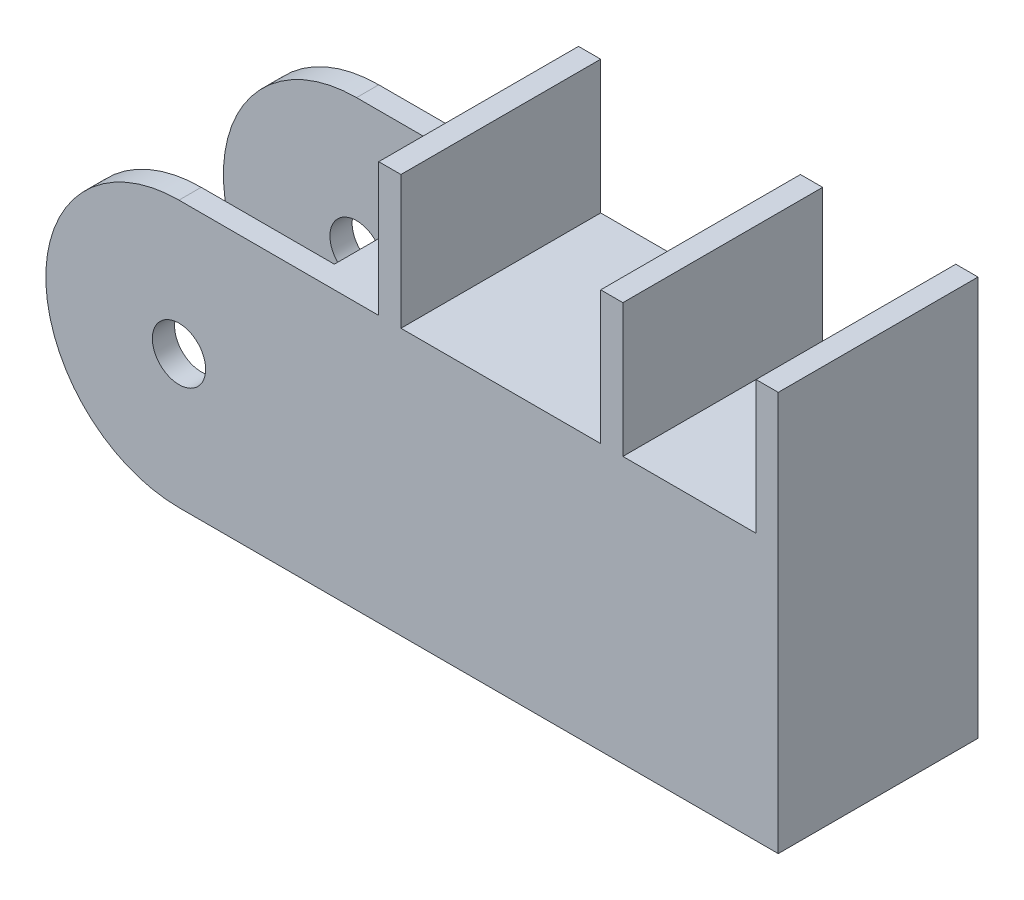
ISO-10303-21;
HEADER;
FILE_DESCRIPTION(('STEP AP214'),'2;1');
FILE_NAME('part.step','',(''),(''),'','','');
FILE_SCHEMA(('AUTOMOTIVE_DESIGN { 1 0 10303 214 1 1 1 1 }'));
ENDSEC;
DATA;
#1=APPLICATION_CONTEXT('core data for automotive mechanical design processes');
#2=APPLICATION_PROTOCOL_DEFINITION('international standard','automotive_design',2000,#1);
#3=PRODUCT_CONTEXT('',#1,'mechanical');
#4=PRODUCT('Part','Part','',(#3));
#5=PRODUCT_RELATED_PRODUCT_CATEGORY('part','',(#4));
#6=PRODUCT_DEFINITION_FORMATION('','',#4);
#7=PRODUCT_DEFINITION_CONTEXT('part definition',#1,'design');
#8=PRODUCT_DEFINITION('design','',#6,#7);
#9=PRODUCT_DEFINITION_SHAPE('','',#8);
#10=(LENGTH_UNIT() NAMED_UNIT(*) SI_UNIT(.MILLI.,.METRE.));
#11=(NAMED_UNIT(*) PLANE_ANGLE_UNIT() SI_UNIT($,.RADIAN.));
#12=(NAMED_UNIT(*) SI_UNIT($,.STERADIAN.) SOLID_ANGLE_UNIT());
#13=UNCERTAINTY_MEASURE_WITH_UNIT(LENGTH_MEASURE(1.E-05),#10,'distance_accuracy_value','');
#14=(GEOMETRIC_REPRESENTATION_CONTEXT(3) GLOBAL_UNCERTAINTY_ASSIGNED_CONTEXT((#13)) GLOBAL_UNIT_ASSIGNED_CONTEXT((#10,
#11,#12)) REPRESENTATION_CONTEXT('',''));
#15=CARTESIAN_POINT('',(0.,0.,0.));
#16=DIRECTION('',(0.,0.,1.));
#17=DIRECTION('',(1.,0.,0.));
#18=AXIS2_PLACEMENT_3D('',#15,#16,#17);
#19=CARTESIAN_POINT('',(-65.,30.,5.));
#20=DIRECTION('',(0.,-1.,0.));
#21=DIRECTION('',(0.,0.,-1.));
#22=AXIS2_PLACEMENT_3D('',#19,#20,#21);
#23=PLANE('',#22);
#24=DIRECTION('',(-1.,0.,0.));
#25=VECTOR('',#24,1.);
#26=CARTESIAN_POINT('',(-65.,30.,45.));
#27=LINE('',#26,#25);
#28=CARTESIAN_POINT('',(-20.,30.,45.));
#29=VERTEX_POINT('',#28);
#30=CARTESIAN_POINT('',(-65.,30.,45.));
#31=VERTEX_POINT('',#30);
#32=EDGE_CURVE('E340',#29,#31,#27,.T.);
#33=ORIENTED_EDGE('',*,*,#32,.F.);
#34=DIRECTION('',(0.,0.,1.));
#35=VECTOR('',#34,1.);
#36=CARTESIAN_POINT('',(-20.,30.,-90.1387818865997));
#37=LINE('',#36,#35);
#38=CARTESIAN_POINT('',(-20.,30.,0.));
#39=VERTEX_POINT('',#38);
#40=EDGE_CURVE('E201',#39,#29,#37,.T.);
#41=ORIENTED_EDGE('',*,*,#40,.F.);
#42=DIRECTION('',(-1.,0.,0.));
#43=VECTOR('',#42,1.);
#44=CARTESIAN_POINT('',(-65.,30.,0.));
#45=LINE('',#44,#43);
#46=CARTESIAN_POINT('',(-65.,30.,0.));
#47=VERTEX_POINT('',#46);
#48=EDGE_CURVE('E197',#39,#47,#45,.T.);
#49=ORIENTED_EDGE('',*,*,#48,.T.);
#50=DIRECTION('',(0.,0.,-1.));
#51=VECTOR('',#50,1.);
#52=CARTESIAN_POINT('',(-65.,30.,5.));
#53=LINE('',#52,#51);
#54=CARTESIAN_POINT('',(-65.,30.,5.));
#55=VERTEX_POINT('',#54);
#56=EDGE_CURVE('E47',#55,#47,#53,.T.);
#57=ORIENTED_EDGE('',*,*,#56,.F.);
#58=DIRECTION('',(-1.,0.,0.));
#59=VECTOR('',#58,1.);
#60=CARTESIAN_POINT('',(-65.,30.,5.));
#61=LINE('',#60,#59);
#62=CARTESIAN_POINT('',(-35.,30.,5.));
#63=VERTEX_POINT('',#62);
#64=EDGE_CURVE('E409',#63,#55,#61,.T.);
#65=ORIENTED_EDGE('',*,*,#64,.F.);
#66=DIRECTION('',(0.,0.,-1.));
#67=VECTOR('',#66,1.);
#68=CARTESIAN_POINT('',(-35.,30.,40.));
#69=LINE('',#68,#67);
#70=CARTESIAN_POINT('',(-35.,30.,40.));
#71=VERTEX_POINT('',#70);
#72=EDGE_CURVE('E379',#71,#63,#69,.T.);
#73=ORIENTED_EDGE('',*,*,#72,.F.);
#74=DIRECTION('',(-1.,0.,0.));
#75=VECTOR('',#74,1.);
#76=CARTESIAN_POINT('',(-65.,30.,40.));
#77=LINE('',#76,#75);
#78=CARTESIAN_POINT('',(-65.,30.,40.));
#79=VERTEX_POINT('',#78);
#80=EDGE_CURVE('E348',#71,#79,#77,.T.);
#81=ORIENTED_EDGE('',*,*,#80,.T.);
#82=DIRECTION('',(0.,0.,1.));
#83=VECTOR('',#82,1.);
#84=CARTESIAN_POINT('',(-65.,30.,40.));
#85=LINE('',#84,#83);
#86=EDGE_CURVE('E375',#79,#31,#85,.T.);
#87=ORIENTED_EDGE('',*,*,#86,.T.);
#88=EDGE_LOOP('',(#33,#41,#49,#57,#65,#73,#81,#87));
#89=FACE_BOUND('',#88,.T.);
#90=ADVANCED_FACE('F38',(#89),#23,.F.);
#91=CARTESIAN_POINT('',(30.,30.,0.));
#92=VERTEX_POINT('',#91);
#93=CARTESIAN_POINT('',(-15.,30.,0.));
#94=VERTEX_POINT('',#93);
#95=EDGE_CURVE('E424',#92,#94,#45,.T.);
#96=ORIENTED_EDGE('',*,*,#95,.T.);
#97=DIRECTION('',(0.,0.,1.));
#98=VECTOR('',#97,1.);
#99=CARTESIAN_POINT('',(-15.,30.,-90.1387818865997));
#100=LINE('',#99,#98);
#101=CARTESIAN_POINT('',(-15.,30.,45.));
#102=VERTEX_POINT('',#101);
#103=EDGE_CURVE('E225',#94,#102,#100,.T.);
#104=ORIENTED_EDGE('',*,*,#103,.T.);
#105=CARTESIAN_POINT('',(30.,30.,45.));
#106=VERTEX_POINT('',#105);
#107=EDGE_CURVE('E366',#106,#102,#27,.T.);
#108=ORIENTED_EDGE('',*,*,#107,.F.);
#109=DIRECTION('',(0.,0.,1.));
#110=VECTOR('',#109,1.);
#111=CARTESIAN_POINT('',(30.,30.,-90.1387818865997));
#112=LINE('',#111,#110);
#113=EDGE_CURVE('E289',#92,#106,#112,.T.);
#114=ORIENTED_EDGE('',*,*,#113,.F.);
#115=EDGE_LOOP('',(#96,#104,#108,#114));
#116=FACE_BOUND('',#115,.T.);
#117=ADVANCED_FACE('F484',(#116),#23,.F.);
#118=CARTESIAN_POINT('',(65.,30.,0.));
#119=VERTEX_POINT('',#118);
#120=CARTESIAN_POINT('',(35.,30.,0.));
#121=VERTEX_POINT('',#120);
#122=EDGE_CURVE('E419',#119,#121,#45,.T.);
#123=ORIENTED_EDGE('',*,*,#122,.T.);
#124=DIRECTION('',(0.,0.,1.));
#125=VECTOR('',#124,1.);
#126=CARTESIAN_POINT('',(35.,30.,-90.1387818865997));
#127=LINE('',#126,#125);
#128=CARTESIAN_POINT('',(35.,30.,45.));
#129=VERTEX_POINT('',#128);
#130=EDGE_CURVE('E285',#121,#129,#127,.T.);
#131=ORIENTED_EDGE('',*,*,#130,.T.);
#132=CARTESIAN_POINT('',(65.,30.,45.));
#133=VERTEX_POINT('',#132);
#134=EDGE_CURVE('E361',#133,#129,#27,.T.);
#135=ORIENTED_EDGE('',*,*,#134,.F.);
#136=DIRECTION('',(0.,0.,-1.));
#137=VECTOR('',#136,1.);
#138=CARTESIAN_POINT('',(65.,30.,5.));
#139=LINE('',#138,#137);
#140=EDGE_CURVE('E11',#133,#119,#139,.T.);
#141=ORIENTED_EDGE('',*,*,#140,.T.);
#142=EDGE_LOOP('',(#123,#131,#135,#141));
#143=FACE_BOUND('',#142,.T.);
#144=ADVANCED_FACE('F40',(#143),#23,.F.);
#145=CARTESIAN_POINT('',(-65.,0.,5.));
#146=DIRECTION('',(0.,0.,-1.));
#147=DIRECTION('',(-1.,0.,0.));
#148=AXIS2_PLACEMENT_3D('',#145,#146,#147);
#149=CYLINDRICAL_SURFACE('',#148,30.);
#150=CARTESIAN_POINT('',(-65.,0.,0.));
#151=DIRECTION('',(0.,0.,1.));
#152=DIRECTION('',(-1.,0.,0.));
#153=AXIS2_PLACEMENT_3D('',#150,#151,#152);
#154=CIRCLE('',#153,30.);
#155=CARTESIAN_POINT('',(-65.,-30.,0.));
#156=VERTEX_POINT('',#155);
#157=EDGE_CURVE('E423',#47,#156,#154,.T.);
#158=ORIENTED_EDGE('',*,*,#157,.T.);
#159=DIRECTION('',(0.,0.,-1.));
#160=VECTOR('',#159,1.);
#161=CARTESIAN_POINT('',(-65.,-30.,5.));
#162=LINE('',#161,#160);
#163=CARTESIAN_POINT('',(-65.,-30.,5.));
#164=VERTEX_POINT('',#163);
#165=EDGE_CURVE('E418',#164,#156,#162,.T.);
#166=ORIENTED_EDGE('',*,*,#165,.F.);
#167=CARTESIAN_POINT('',(-65.,0.,5.));
#168=DIRECTION('',(0.,0.,1.));
#169=DIRECTION('',(-1.,0.,0.));
#170=AXIS2_PLACEMENT_3D('',#167,#168,#169);
#171=CIRCLE('',#170,30.);
#172=EDGE_CURVE('E413',#55,#164,#171,.T.);
#173=ORIENTED_EDGE('',*,*,#172,.F.);
#174=ORIENTED_EDGE('',*,*,#56,.T.);
#175=EDGE_LOOP('',(#158,#166,#173,#174));
#176=FACE_BOUND('',#175,.T.);
#177=ADVANCED_FACE('F436',(#176),#149,.T.);
#178=CARTESIAN_POINT('',(-65.,-30.,5.));
#179=DIRECTION('',(0.,1.,0.));
#180=DIRECTION('',(0.,0.,1.));
#181=AXIS2_PLACEMENT_3D('',#178,#179,#180);
#182=PLANE('',#181);
#183=DIRECTION('',(1.,0.,0.));
#184=VECTOR('',#183,1.);
#185=CARTESIAN_POINT('',(-65.,-30.,0.));
#186=LINE('',#185,#184);
#187=CARTESIAN_POINT('',(70.,-30.,0.));
#188=VERTEX_POINT('',#187);
#189=EDGE_CURVE('E410',#156,#188,#186,.T.);
#190=ORIENTED_EDGE('',*,*,#189,.T.);
#191=DIRECTION('',(0.,0.,1.));
#192=VECTOR('',#191,1.);
#193=CARTESIAN_POINT('',(70.,-30.,-90.1387818865997));
#194=LINE('',#193,#192);
#195=CARTESIAN_POINT('',(70.,-30.,45.));
#196=VERTEX_POINT('',#195);
#197=EDGE_CURVE('E239',#188,#196,#194,.T.);
#198=ORIENTED_EDGE('',*,*,#197,.T.);
#199=DIRECTION('',(1.,0.,0.));
#200=VECTOR('',#199,1.);
#201=CARTESIAN_POINT('',(-65.,-30.,45.));
#202=LINE('',#201,#200);
#203=CARTESIAN_POINT('',(-65.,-30.,45.));
#204=VERTEX_POINT('',#203);
#205=EDGE_CURVE('E349',#204,#196,#202,.T.);
#206=ORIENTED_EDGE('',*,*,#205,.F.);
#207=DIRECTION('',(0.,0.,1.));
#208=VECTOR('',#207,1.);
#209=CARTESIAN_POINT('',(-65.,-30.,40.));
#210=LINE('',#209,#208);
#211=CARTESIAN_POINT('',(-65.,-30.,40.));
#212=VERTEX_POINT('',#211);
#213=EDGE_CURVE('E360',#212,#204,#210,.T.);
#214=ORIENTED_EDGE('',*,*,#213,.F.);
#215=DIRECTION('',(1.,0.,0.));
#216=VECTOR('',#215,1.);
#217=CARTESIAN_POINT('',(-65.,-30.,40.));
#218=LINE('',#217,#216);
#219=CARTESIAN_POINT('',(-35.,-30.,40.));
#220=VERTEX_POINT('',#219);
#221=EDGE_CURVE('E356',#212,#220,#218,.T.);
#222=ORIENTED_EDGE('',*,*,#221,.T.);
#223=DIRECTION('',(0.,0.,-1.));
#224=VECTOR('',#223,1.);
#225=CARTESIAN_POINT('',(-35.,-30.,40.));
#226=LINE('',#225,#224);
#227=CARTESIAN_POINT('',(-35.,-30.,5.));
#228=VERTEX_POINT('',#227);
#229=EDGE_CURVE('E315',#220,#228,#226,.T.);
#230=ORIENTED_EDGE('',*,*,#229,.T.);
#231=DIRECTION('',(1.,0.,0.));
#232=VECTOR('',#231,1.);
#233=CARTESIAN_POINT('',(-65.,-30.,5.));
#234=LINE('',#233,#232);
#235=EDGE_CURVE('E415',#164,#228,#234,.T.);
#236=ORIENTED_EDGE('',*,*,#235,.F.);
#237=ORIENTED_EDGE('',*,*,#165,.T.);
#238=EDGE_LOOP('',(#190,#198,#206,#214,#222,#230,#236,#237));
#239=FACE_BOUND('',#238,.T.);
#240=ADVANCED_FACE('F444',(#239),#182,.F.);
#241=CARTESIAN_POINT('',(-65.,0.,5.));
#242=DIRECTION('',(0.,0.,-1.));
#243=DIRECTION('',(-1.,0.,0.));
#244=AXIS2_PLACEMENT_3D('',#241,#242,#243);
#245=PLANE('',#244);
#246=CARTESIAN_POINT('',(-65.,0.,5.));
#247=DIRECTION('',(0.,0.,-1.));
#248=DIRECTION('',(-1.,0.,0.));
#249=AXIS2_PLACEMENT_3D('',#246,#247,#248);
#250=CIRCLE('',#249,6.);
#251=CARTESIAN_POINT('',(-59.,0.,5.));
#252=VERTEX_POINT('',#251);
#253=EDGE_CURVE('E311',#252,#252,#250,.T.);
#254=ORIENTED_EDGE('',*,*,#253,.T.);
#255=EDGE_LOOP('',(#254));
#256=FACE_BOUND('',#255,.T.);
#257=ORIENTED_EDGE('',*,*,#235,.T.);
#258=DIRECTION('',(0.,-1.,0.));
#259=VECTOR('',#258,1.);
#260=CARTESIAN_POINT('',(-35.,-25.,5.00000000000001));
#261=LINE('',#260,#259);
#262=CARTESIAN_POINT('',(-35.,-25.,5.));
#263=VERTEX_POINT('',#262);
#264=EDGE_CURVE('E336',#263,#228,#261,.T.);
#265=ORIENTED_EDGE('',*,*,#264,.F.);
#266=DIRECTION('',(-1.,0.,0.));
#267=VECTOR('',#266,1.);
#268=CARTESIAN_POINT('',(65.,-25.,5.));
#269=LINE('',#268,#267);
#270=CARTESIAN_POINT('',(65.,-25.,5.));
#271=VERTEX_POINT('',#270);
#272=EDGE_CURVE('E328',#271,#263,#269,.T.);
#273=ORIENTED_EDGE('',*,*,#272,.F.);
#274=DIRECTION('',(0.,1.,0.));
#275=VECTOR('',#274,1.);
#276=CARTESIAN_POINT('',(65.,-30.,5.));
#277=LINE('',#276,#275);
#278=CARTESIAN_POINT('',(65.,25.,5.));
#279=VERTEX_POINT('',#278);
#280=EDGE_CURVE('E405',#271,#279,#277,.T.);
#281=ORIENTED_EDGE('',*,*,#280,.T.);
#282=DIRECTION('',(-1.,0.,0.));
#283=VECTOR('',#282,1.);
#284=CARTESIAN_POINT('',(65.,25.,5.));
#285=LINE('',#284,#283);
#286=CARTESIAN_POINT('',(-35.,25.,5.00000000000001));
#287=VERTEX_POINT('',#286);
#288=EDGE_CURVE('E384',#279,#287,#285,.T.);
#289=ORIENTED_EDGE('',*,*,#288,.T.);
#290=DIRECTION('',(0.,1.,0.));
#291=VECTOR('',#290,1.);
#292=CARTESIAN_POINT('',(-35.,25.,5.00000000000001));
#293=LINE('',#292,#291);
#294=EDGE_CURVE('E395',#287,#63,#293,.T.);
#295=ORIENTED_EDGE('',*,*,#294,.T.);
#296=ORIENTED_EDGE('',*,*,#64,.T.);
#297=ORIENTED_EDGE('',*,*,#172,.T.);
#298=EDGE_LOOP('',(#257,#265,#273,#281,#289,#295,#296,#297));
#299=FACE_BOUND('',#298,.T.);
#300=ADVANCED_FACE('F448',(#256,#299),#245,.F.);
#301=CARTESIAN_POINT('',(-65.,0.,0.));
#302=DIRECTION('',(0.,0.,-1.));
#303=DIRECTION('',(-1.,0.,0.));
#304=AXIS2_PLACEMENT_3D('',#301,#302,#303);
#305=PLANE('',#304);
#306=CARTESIAN_POINT('',(-65.,0.,0.));
#307=DIRECTION('',(0.,0.,1.));
#308=DIRECTION('',(1.,0.,0.));
#309=AXIS2_PLACEMENT_3D('',#306,#307,#308);
#310=CIRCLE('',#309,6.);
#311=CARTESIAN_POINT('',(-59.,0.,0.));
#312=VERTEX_POINT('',#311);
#313=EDGE_CURVE('E300',#312,#312,#310,.T.);
#314=ORIENTED_EDGE('',*,*,#313,.T.);
#315=EDGE_LOOP('',(#314));
#316=FACE_BOUND('',#315,.T.);
#317=ORIENTED_EDGE('',*,*,#122,.F.);
#318=DIRECTION('',(0.,-1.,0.));
#319=VECTOR('',#318,1.);
#320=CARTESIAN_POINT('',(65.,-30.,0.));
#321=LINE('',#320,#319);
#322=CARTESIAN_POINT('',(65.,60.,0.));
#323=VERTEX_POINT('',#322);
#324=EDGE_CURVE('E247',#323,#119,#321,.T.);
#325=ORIENTED_EDGE('',*,*,#324,.F.);
#326=DIRECTION('',(-1.,0.,0.));
#327=VECTOR('',#326,1.);
#328=CARTESIAN_POINT('',(65.,60.,0.));
#329=LINE('',#328,#327);
#330=CARTESIAN_POINT('',(70.,60.,0.));
#331=VERTEX_POINT('',#330);
#332=EDGE_CURVE('E252',#331,#323,#329,.T.);
#333=ORIENTED_EDGE('',*,*,#332,.F.);
#334=DIRECTION('',(0.,1.,0.));
#335=VECTOR('',#334,1.);
#336=CARTESIAN_POINT('',(70.,-30.,0.));
#337=LINE('',#336,#335);
#338=EDGE_CURVE('E256',#188,#331,#337,.T.);
#339=ORIENTED_EDGE('',*,*,#338,.F.);
#340=ORIENTED_EDGE('',*,*,#189,.F.);
#341=ORIENTED_EDGE('',*,*,#157,.F.);
#342=ORIENTED_EDGE('',*,*,#48,.F.);
#343=DIRECTION('',(0.,-1.,0.));
#344=VECTOR('',#343,1.);
#345=CARTESIAN_POINT('',(-20.,30.,0.));
#346=LINE('',#345,#344);
#347=CARTESIAN_POINT('',(-20.,60.,0.));
#348=VERTEX_POINT('',#347);
#349=EDGE_CURVE('E189',#348,#39,#346,.T.);
#350=ORIENTED_EDGE('',*,*,#349,.F.);
#351=DIRECTION('',(-1.,0.,0.));
#352=VECTOR('',#351,1.);
#353=CARTESIAN_POINT('',(-15.,60.,0.));
#354=LINE('',#353,#352);
#355=CARTESIAN_POINT('',(-15.,60.,0.));
#356=VERTEX_POINT('',#355);
#357=EDGE_CURVE('E194',#356,#348,#354,.T.);
#358=ORIENTED_EDGE('',*,*,#357,.F.);
#359=DIRECTION('',(0.,1.,0.));
#360=VECTOR('',#359,1.);
#361=CARTESIAN_POINT('',(-15.,30.,0.));
#362=LINE('',#361,#360);
#363=EDGE_CURVE('E223',#94,#356,#362,.T.);
#364=ORIENTED_EDGE('',*,*,#363,.F.);
#365=ORIENTED_EDGE('',*,*,#95,.F.);
#366=DIRECTION('',(0.,-1.,0.));
#367=VECTOR('',#366,1.);
#368=CARTESIAN_POINT('',(30.,30.,0.));
#369=LINE('',#368,#367);
#370=CARTESIAN_POINT('',(30.,60.,0.));
#371=VERTEX_POINT('',#370);
#372=EDGE_CURVE('E286',#371,#92,#369,.T.);
#373=ORIENTED_EDGE('',*,*,#372,.F.);
#374=DIRECTION('',(-1.,0.,0.));
#375=VECTOR('',#374,1.);
#376=CARTESIAN_POINT('',(35.,60.,0.));
#377=LINE('',#376,#375);
#378=CARTESIAN_POINT('',(35.,60.,0.));
#379=VERTEX_POINT('',#378);
#380=EDGE_CURVE('E269',#379,#371,#377,.T.);
#381=ORIENTED_EDGE('',*,*,#380,.F.);
#382=DIRECTION('',(0.,1.,0.));
#383=VECTOR('',#382,1.);
#384=CARTESIAN_POINT('',(35.,30.,0.));
#385=LINE('',#384,#383);
#386=EDGE_CURVE('E280',#121,#379,#385,.T.);
#387=ORIENTED_EDGE('',*,*,#386,.F.);
#388=EDGE_LOOP('',(#317,#325,#333,#339,#340,#341,#342,#350,#358,#364,#365,#373,#381,#387));
#389=FACE_BOUND('',#388,.T.);
#390=ADVANCED_FACE('F192',(#316,#389),#305,.T.);
#391=CARTESIAN_POINT('',(-35.,25.,40.));
#392=DIRECTION('',(1.,0.,0.));
#393=DIRECTION('',(0.,0.,-1.));
#394=AXIS2_PLACEMENT_3D('',#391,#392,#393);
#395=PLANE('',#394);
#396=ORIENTED_EDGE('',*,*,#72,.T.);
#397=ORIENTED_EDGE('',*,*,#294,.F.);
#398=DIRECTION('',(0.,0.,-1.));
#399=VECTOR('',#398,1.);
#400=CARTESIAN_POINT('',(-35.,25.,40.));
#401=LINE('',#400,#399);
#402=CARTESIAN_POINT('',(-35.,25.,40.));
#403=VERTEX_POINT('',#402);
#404=EDGE_CURVE('E388',#403,#287,#401,.T.);
#405=ORIENTED_EDGE('',*,*,#404,.F.);
#406=DIRECTION('',(0.,1.,0.));
#407=VECTOR('',#406,1.);
#408=CARTESIAN_POINT('',(-35.,25.,40.));
#409=LINE('',#408,#407);
#410=EDGE_CURVE('E398',#403,#71,#409,.T.);
#411=ORIENTED_EDGE('',*,*,#410,.T.);
#412=EDGE_LOOP('',(#396,#397,#405,#411));
#413=FACE_BOUND('',#412,.T.);
#414=ADVANCED_FACE('F467',(#413),#395,.F.);
#415=CARTESIAN_POINT('',(0.,25.,0.));
#416=DIRECTION('',(0.,1.,0.));
#417=DIRECTION('',(0.,0.,1.));
#418=AXIS2_PLACEMENT_3D('',#415,#416,#417);
#419=PLANE('',#418);
#420=DIRECTION('',(0.,0.,-1.));
#421=VECTOR('',#420,1.);
#422=CARTESIAN_POINT('',(65.,25.,40.));
#423=LINE('',#422,#421);
#424=CARTESIAN_POINT('',(65.,25.,40.));
#425=VERTEX_POINT('',#424);
#426=EDGE_CURVE('E380',#425,#279,#423,.T.);
#427=ORIENTED_EDGE('',*,*,#426,.F.);
#428=DIRECTION('',(-1.,0.,0.));
#429=VECTOR('',#428,1.);
#430=CARTESIAN_POINT('',(65.,25.,40.));
#431=LINE('',#430,#429);
#432=EDGE_CURVE('E391',#425,#403,#431,.T.);
#433=ORIENTED_EDGE('',*,*,#432,.T.);
#434=ORIENTED_EDGE('',*,*,#404,.T.);
#435=ORIENTED_EDGE('',*,*,#288,.F.);
#436=EDGE_LOOP('',(#427,#433,#434,#435));
#437=FACE_BOUND('',#436,.T.);
#438=ADVANCED_FACE('F464',(#437),#419,.F.);
#439=CARTESIAN_POINT('',(-65.,0.,40.));
#440=DIRECTION('',(0.,0.,1.));
#441=DIRECTION('',(-1.,0.,0.));
#442=AXIS2_PLACEMENT_3D('',#439,#440,#441);
#443=CYLINDRICAL_SURFACE('',#442,30.);
#444=CARTESIAN_POINT('',(-65.,0.,45.));
#445=DIRECTION('',(0.,0.,1.));
#446=DIRECTION('',(-1.,0.,0.));
#447=AXIS2_PLACEMENT_3D('',#444,#445,#446);
#448=CIRCLE('',#447,30.);
#449=EDGE_CURVE('E365',#31,#204,#448,.T.);
#450=ORIENTED_EDGE('',*,*,#449,.F.);
#451=ORIENTED_EDGE('',*,*,#86,.F.);
#452=CARTESIAN_POINT('',(-65.,0.,40.));
#453=DIRECTION('',(0.,0.,1.));
#454=DIRECTION('',(-1.,0.,0.));
#455=AXIS2_PLACEMENT_3D('',#452,#453,#454);
#456=CIRCLE('',#455,30.);
#457=EDGE_CURVE('E352',#79,#212,#456,.T.);
#458=ORIENTED_EDGE('',*,*,#457,.T.);
#459=ORIENTED_EDGE('',*,*,#213,.T.);
#460=EDGE_LOOP('',(#450,#451,#458,#459));
#461=FACE_BOUND('',#460,.T.);
#462=ADVANCED_FACE('F475',(#461),#443,.T.);
#463=CARTESIAN_POINT('',(-65.,0.,40.));
#464=DIRECTION('',(0.,0.,1.));
#465=DIRECTION('',(-1.,0.,0.));
#466=AXIS2_PLACEMENT_3D('',#463,#464,#465);
#467=PLANE('',#466);
#468=CARTESIAN_POINT('',(-65.,0.,40.));
#469=DIRECTION('',(0.,0.,1.));
#470=DIRECTION('',(1.,0.,0.));
#471=AXIS2_PLACEMENT_3D('',#468,#469,#470);
#472=CIRCLE('',#471,6.);
#473=CARTESIAN_POINT('',(-59.,0.,40.));
#474=VERTEX_POINT('',#473);
#475=EDGE_CURVE('E304',#474,#474,#472,.T.);
#476=ORIENTED_EDGE('',*,*,#475,.T.);
#477=EDGE_LOOP('',(#476));
#478=FACE_BOUND('',#477,.T.);
#479=DIRECTION('',(-1.,0.,0.));
#480=VECTOR('',#479,1.);
#481=CARTESIAN_POINT('',(65.,-25.,40.));
#482=LINE('',#481,#480);
#483=CARTESIAN_POINT('',(65.,-25.,40.));
#484=VERTEX_POINT('',#483);
#485=CARTESIAN_POINT('',(-35.,-25.,40.));
#486=VERTEX_POINT('',#485);
#487=EDGE_CURVE('E320',#484,#486,#482,.T.);
#488=ORIENTED_EDGE('',*,*,#487,.T.);
#489=DIRECTION('',(0.,-1.,0.));
#490=VECTOR('',#489,1.);
#491=CARTESIAN_POINT('',(-35.,-25.,40.));
#492=LINE('',#491,#490);
#493=EDGE_CURVE('E332',#486,#220,#492,.T.);
#494=ORIENTED_EDGE('',*,*,#493,.T.);
#495=ORIENTED_EDGE('',*,*,#221,.F.);
#496=ORIENTED_EDGE('',*,*,#457,.F.);
#497=ORIENTED_EDGE('',*,*,#80,.F.);
#498=ORIENTED_EDGE('',*,*,#410,.F.);
#499=ORIENTED_EDGE('',*,*,#432,.F.);
#500=DIRECTION('',(0.,1.,0.));
#501=VECTOR('',#500,1.);
#502=CARTESIAN_POINT('',(65.,-30.,40.));
#503=LINE('',#502,#501);
#504=EDGE_CURVE('E344',#484,#425,#503,.T.);
#505=ORIENTED_EDGE('',*,*,#504,.F.);
#506=EDGE_LOOP('',(#488,#494,#495,#496,#497,#498,#499,#505));
#507=FACE_BOUND('',#506,.T.);
#508=ADVANCED_FACE('F456',(#478,#507),#467,.F.);
#509=CARTESIAN_POINT('',(-65.,0.,45.));
#510=DIRECTION('',(0.,0.,1.));
#511=DIRECTION('',(-1.,0.,0.));
#512=AXIS2_PLACEMENT_3D('',#509,#510,#511);
#513=PLANE('',#512);
#514=CARTESIAN_POINT('',(-65.,0.,45.));
#515=DIRECTION('',(0.,0.,1.));
#516=DIRECTION('',(1.,0.,0.));
#517=AXIS2_PLACEMENT_3D('',#514,#515,#516);
#518=CIRCLE('',#517,6.);
#519=CARTESIAN_POINT('',(-59.,0.,45.));
#520=VERTEX_POINT('',#519);
#521=EDGE_CURVE('E299',#520,#520,#518,.T.);
#522=ORIENTED_EDGE('',*,*,#521,.F.);
#523=EDGE_LOOP('',(#522));
#524=FACE_BOUND('',#523,.T.);
#525=ORIENTED_EDGE('',*,*,#205,.T.);
#526=DIRECTION('',(0.,1.,0.));
#527=VECTOR('',#526,1.);
#528=CARTESIAN_POINT('',(70.,-30.,45.));
#529=LINE('',#528,#527);
#530=CARTESIAN_POINT('',(70.,60.,45.));
#531=VERTEX_POINT('',#530);
#532=EDGE_CURVE('E240',#196,#531,#529,.T.);
#533=ORIENTED_EDGE('',*,*,#532,.T.);
#534=DIRECTION('',(-1.,0.,0.));
#535=VECTOR('',#534,1.);
#536=CARTESIAN_POINT('',(65.,60.,45.));
#537=LINE('',#536,#535);
#538=CARTESIAN_POINT('',(65.,60.,45.));
#539=VERTEX_POINT('',#538);
#540=EDGE_CURVE('E235',#531,#539,#537,.T.);
#541=ORIENTED_EDGE('',*,*,#540,.T.);
#542=DIRECTION('',(0.,-1.,0.));
#543=VECTOR('',#542,1.);
#544=CARTESIAN_POINT('',(65.,-30.,45.));
#545=LINE('',#544,#543);
#546=EDGE_CURVE('E234',#539,#133,#545,.T.);
#547=ORIENTED_EDGE('',*,*,#546,.T.);
#548=ORIENTED_EDGE('',*,*,#134,.T.);
#549=DIRECTION('',(0.,1.,0.));
#550=VECTOR('',#549,1.);
#551=CARTESIAN_POINT('',(35.,30.,45.));
#552=LINE('',#551,#550);
#553=CARTESIAN_POINT('',(35.,60.,45.));
#554=VERTEX_POINT('',#553);
#555=EDGE_CURVE('E250',#129,#554,#552,.T.);
#556=ORIENTED_EDGE('',*,*,#555,.T.);
#557=DIRECTION('',(-1.,0.,0.));
#558=VECTOR('',#557,1.);
#559=CARTESIAN_POINT('',(35.,60.,45.));
#560=LINE('',#559,#558);
#561=CARTESIAN_POINT('',(30.,60.,45.));
#562=VERTEX_POINT('',#561);
#563=EDGE_CURVE('E270',#554,#562,#560,.T.);
#564=ORIENTED_EDGE('',*,*,#563,.T.);
#565=DIRECTION('',(0.,-1.,0.));
#566=VECTOR('',#565,1.);
#567=CARTESIAN_POINT('',(30.,30.,45.));
#568=LINE('',#567,#566);
#569=EDGE_CURVE('E61',#562,#106,#568,.T.);
#570=ORIENTED_EDGE('',*,*,#569,.T.);
#571=ORIENTED_EDGE('',*,*,#107,.T.);
#572=DIRECTION('',(0.,1.,0.));
#573=VECTOR('',#572,1.);
#574=CARTESIAN_POINT('',(-15.,30.,45.));
#575=LINE('',#574,#573);
#576=CARTESIAN_POINT('',(-15.,60.,45.));
#577=VERTEX_POINT('',#576);
#578=EDGE_CURVE('E221',#102,#577,#575,.T.);
#579=ORIENTED_EDGE('',*,*,#578,.T.);
#580=DIRECTION('',(-1.,0.,0.));
#581=VECTOR('',#580,1.);
#582=CARTESIAN_POINT('',(-15.,60.,45.));
#583=LINE('',#582,#581);
#584=CARTESIAN_POINT('',(-20.,60.,45.));
#585=VERTEX_POINT('',#584);
#586=EDGE_CURVE('E217',#577,#585,#583,.T.);
#587=ORIENTED_EDGE('',*,*,#586,.T.);
#588=DIRECTION('',(0.,-1.,0.));
#589=VECTOR('',#588,1.);
#590=CARTESIAN_POINT('',(-20.,30.,45.));
#591=LINE('',#590,#589);
#592=EDGE_CURVE('E54',#585,#29,#591,.T.);
#593=ORIENTED_EDGE('',*,*,#592,.T.);
#594=ORIENTED_EDGE('',*,*,#32,.T.);
#595=ORIENTED_EDGE('',*,*,#449,.T.);
#596=EDGE_LOOP('',(#525,#533,#541,#547,#548,#556,#564,#570,#571,#579,#587,#593,#594,#595));
#597=FACE_BOUND('',#596,.T.);
#598=ADVANCED_FACE('F476',(#524,#597),#513,.T.);
#599=CARTESIAN_POINT('',(-35.,-25.,40.));
#600=DIRECTION('',(-1.,0.,0.));
#601=DIRECTION('',(0.,0.,1.));
#602=AXIS2_PLACEMENT_3D('',#599,#600,#601);
#603=PLANE('',#602);
#604=ORIENTED_EDGE('',*,*,#229,.F.);
#605=ORIENTED_EDGE('',*,*,#493,.F.);
#606=DIRECTION('',(0.,0.,-1.));
#607=VECTOR('',#606,1.);
#608=CARTESIAN_POINT('',(-35.,-25.,40.));
#609=LINE('',#608,#607);
#610=EDGE_CURVE('E324',#486,#263,#609,.T.);
#611=ORIENTED_EDGE('',*,*,#610,.T.);
#612=ORIENTED_EDGE('',*,*,#264,.T.);
#613=EDGE_LOOP('',(#604,#605,#611,#612));
#614=FACE_BOUND('',#613,.T.);
#615=ADVANCED_FACE('F450',(#614),#603,.T.);
#616=CARTESIAN_POINT('',(0.,-25.,0.));
#617=DIRECTION('',(0.,-1.,0.));
#618=DIRECTION('',(0.,0.,1.));
#619=AXIS2_PLACEMENT_3D('',#616,#617,#618);
#620=PLANE('',#619);
#621=DIRECTION('',(0.,0.,-1.));
#622=VECTOR('',#621,1.);
#623=CARTESIAN_POINT('',(65.,-25.,40.));
#624=LINE('',#623,#622);
#625=EDGE_CURVE('E316',#484,#271,#624,.T.);
#626=ORIENTED_EDGE('',*,*,#625,.T.);
#627=ORIENTED_EDGE('',*,*,#272,.T.);
#628=ORIENTED_EDGE('',*,*,#610,.F.);
#629=ORIENTED_EDGE('',*,*,#487,.F.);
#630=EDGE_LOOP('',(#626,#627,#628,#629));
#631=FACE_BOUND('',#630,.T.);
#632=ADVANCED_FACE('F453',(#631),#620,.F.);
#633=CARTESIAN_POINT('',(-65.,0.,0.));
#634=DIRECTION('',(0.,0.,1.));
#635=DIRECTION('',(1.,0.,0.));
#636=AXIS2_PLACEMENT_3D('',#633,#634,#635);
#637=CYLINDRICAL_SURFACE('',#636,6.);
#638=CARTESIAN_POINT('',(-59.,0.,45.));
#639=CARTESIAN_POINT('',(-59.,0.,44.9479166666667));
#640=CARTESIAN_POINT('',(-59.,0.,44.8958333333333));
#641=CARTESIAN_POINT('',(-59.,0.,44.7916666666667));
#642=CARTESIAN_POINT('',(-59.,0.,44.7395833333333));
#643=CARTESIAN_POINT('',(-59.,0.,44.6354166666667));
#644=CARTESIAN_POINT('',(-59.,0.,44.5833333333333));
#645=CARTESIAN_POINT('',(-59.,0.,44.4791666666667));
#646=CARTESIAN_POINT('',(-59.,0.,44.4270833333333));
#647=CARTESIAN_POINT('',(-59.,0.,44.3229166666667));
#648=CARTESIAN_POINT('',(-59.,0.,44.2708333333333));
#649=CARTESIAN_POINT('',(-59.,0.,44.1666666666667));
#650=CARTESIAN_POINT('',(-59.,0.,44.1145833333333));
#651=CARTESIAN_POINT('',(-59.,0.,44.0104166666667));
#652=CARTESIAN_POINT('',(-59.,0.,43.9583333333333));
#653=CARTESIAN_POINT('',(-59.,0.,43.8541666666667));
#654=CARTESIAN_POINT('',(-59.,0.,43.8020833333333));
#655=CARTESIAN_POINT('',(-59.,0.,43.6979166666667));
#656=CARTESIAN_POINT('',(-59.,0.,43.6458333333333));
#657=CARTESIAN_POINT('',(-59.,0.,43.5416666666667));
#658=CARTESIAN_POINT('',(-59.,0.,43.4895833333333));
#659=CARTESIAN_POINT('',(-59.,0.,43.3854166666667));
#660=CARTESIAN_POINT('',(-59.,0.,43.3333333333333));
#661=CARTESIAN_POINT('',(-59.,0.,43.2291666666667));
#662=CARTESIAN_POINT('',(-59.,0.,43.1770833333333));
#663=CARTESIAN_POINT('',(-59.,0.,43.0729166666667));
#664=CARTESIAN_POINT('',(-59.,0.,43.0208333333333));
#665=CARTESIAN_POINT('',(-59.,0.,42.9166666666667));
#666=CARTESIAN_POINT('',(-59.,0.,42.8645833333333));
#667=CARTESIAN_POINT('',(-59.,0.,42.7604166666667));
#668=CARTESIAN_POINT('',(-59.,0.,42.7083333333333));
#669=CARTESIAN_POINT('',(-59.,0.,42.6041666666667));
#670=CARTESIAN_POINT('',(-59.,0.,42.5520833333333));
#671=CARTESIAN_POINT('',(-59.,0.,42.4479166666667));
#672=CARTESIAN_POINT('',(-59.,0.,42.3958333333333));
#673=CARTESIAN_POINT('',(-59.,0.,42.2916666666667));
#674=CARTESIAN_POINT('',(-59.,0.,42.2395833333333));
#675=CARTESIAN_POINT('',(-59.,0.,42.1354166666667));
#676=CARTESIAN_POINT('',(-59.,0.,42.0833333333333));
#677=CARTESIAN_POINT('',(-59.,0.,41.9791666666667));
#678=CARTESIAN_POINT('',(-59.,0.,41.9270833333333));
#679=CARTESIAN_POINT('',(-59.,0.,41.8229166666667));
#680=CARTESIAN_POINT('',(-59.,0.,41.7708333333333));
#681=CARTESIAN_POINT('',(-59.,0.,41.6666666666667));
#682=CARTESIAN_POINT('',(-59.,0.,41.6145833333333));
#683=CARTESIAN_POINT('',(-59.,0.,41.5104166666667));
#684=CARTESIAN_POINT('',(-59.,0.,41.4583333333333));
#685=CARTESIAN_POINT('',(-59.,0.,41.3541666666667));
#686=CARTESIAN_POINT('',(-59.,0.,41.3020833333333));
#687=CARTESIAN_POINT('',(-59.,0.,41.1979166666667));
#688=CARTESIAN_POINT('',(-59.,0.,41.1458333333333));
#689=CARTESIAN_POINT('',(-59.,0.,41.0416666666667));
#690=CARTESIAN_POINT('',(-59.,0.,40.9895833333333));
#691=CARTESIAN_POINT('',(-59.,0.,40.8854166666667));
#692=CARTESIAN_POINT('',(-59.,0.,40.8333333333333));
#693=CARTESIAN_POINT('',(-59.,0.,40.7291666666667));
#694=CARTESIAN_POINT('',(-59.,0.,40.6770833333333));
#695=CARTESIAN_POINT('',(-59.,0.,40.5729166666667));
#696=CARTESIAN_POINT('',(-59.,0.,40.5208333333333));
#697=CARTESIAN_POINT('',(-59.,0.,40.4166666666667));
#698=CARTESIAN_POINT('',(-59.,0.,40.3645833333333));
#699=CARTESIAN_POINT('',(-59.,0.,40.2604166666667));
#700=CARTESIAN_POINT('',(-59.,0.,40.2083333333333));
#701=CARTESIAN_POINT('',(-59.,0.,40.1041666666667));
#702=CARTESIAN_POINT('',(-59.,0.,40.0520833333333));
#703=CARTESIAN_POINT('',(-59.,0.,40.));
#704=B_SPLINE_CURVE_WITH_KNOTS('',3,(#638,#639,#640,#641,#642,#643,#644,#645,#646,#647,#648,
#649,#650,#651,#652,#653,#654,#655,#656,#657,#658,#659,#660,#661,#662,#663,#664,#665,#666,#667,
#668,#669,#670,#671,#672,#673,#674,#675,#676,#677,#678,#679,#680,#681,#682,#683,#684,#685,#686,
#687,#688,#689,#690,#691,#692,#693,#694,#695,#696,#697,#698,#699,#700,#701,#702,#703),
.UNSPECIFIED.,.F.,.F.,(4,2,2,2,2,2,2,2,2,2,2,2,2,2,2,2,2,2,2,2,2,2,2,2,2,2,2,2,2,2,2,2,4),(0.,
0.156249999999997,0.3125,0.468750000000004,0.625000000000001,0.781249999999997,
0.937500000000001,1.09375,1.25,1.40625,1.5625,1.71875,1.875,2.03125,2.1875,2.34375000000001,2.5,
2.65625,2.8125,2.96875000000001,3.125,3.28125,3.4375,3.59375000000001,3.75,3.90625,4.0625,
4.21875000000001,4.375,4.53125,4.6875,4.84375000000001,5.),.UNSPECIFIED.);
#705=EDGE_CURVE('BSEAM559',#520,#474,#704,.T.);
#706=ORIENTED_EDGE('',*,*,#521,.T.);
#707=ORIENTED_EDGE('',*,*,#475,.F.);
#708=ORIENTED_EDGE('',*,*,#705,.T.);
#709=ORIENTED_EDGE('',*,*,#705,.F.);
#710=EDGE_LOOP('',(#706,#708,#707,#709));
#711=FACE_BOUND('',#710,.T.);
#712=ADVANCED_FACE('F559',(#711),#637,.F.);
#713=CARTESIAN_POINT('',(-59.,0.,0.));
#714=CARTESIAN_POINT('',(-59.,0.,0.0520833333333334));
#715=CARTESIAN_POINT('',(-59.,0.,0.104166666666667));
#716=CARTESIAN_POINT('',(-59.,0.,0.208333333333333));
#717=CARTESIAN_POINT('',(-59.,0.,0.260416666666667));
#718=CARTESIAN_POINT('',(-59.,0.,0.364583333333333));
#719=CARTESIAN_POINT('',(-59.,0.,0.416666666666667));
#720=CARTESIAN_POINT('',(-59.,0.,0.520833333333333));
#721=CARTESIAN_POINT('',(-59.,0.,0.572916666666667));
#722=CARTESIAN_POINT('',(-59.,0.,0.677083333333333));
#723=CARTESIAN_POINT('',(-59.,0.,0.729166666666667));
#724=CARTESIAN_POINT('',(-59.,0.,0.833333333333333));
#725=CARTESIAN_POINT('',(-59.,0.,0.885416666666667));
#726=CARTESIAN_POINT('',(-59.,0.,0.989583333333333));
#727=CARTESIAN_POINT('',(-59.,0.,1.04166666666667));
#728=CARTESIAN_POINT('',(-59.,0.,1.14583333333333));
#729=CARTESIAN_POINT('',(-59.,0.,1.19791666666667));
#730=CARTESIAN_POINT('',(-59.,0.,1.30208333333333));
#731=CARTESIAN_POINT('',(-59.,0.,1.35416666666667));
#732=CARTESIAN_POINT('',(-59.,0.,1.45833333333333));
#733=CARTESIAN_POINT('',(-59.,0.,1.51041666666667));
#734=CARTESIAN_POINT('',(-59.,0.,1.61458333333333));
#735=CARTESIAN_POINT('',(-59.,0.,1.66666666666667));
#736=CARTESIAN_POINT('',(-59.,0.,1.77083333333333));
#737=CARTESIAN_POINT('',(-59.,0.,1.82291666666667));
#738=CARTESIAN_POINT('',(-59.,0.,1.92708333333333));
#739=CARTESIAN_POINT('',(-59.,0.,1.97916666666667));
#740=CARTESIAN_POINT('',(-59.,0.,2.08333333333333));
#741=CARTESIAN_POINT('',(-59.,0.,2.13541666666667));
#742=CARTESIAN_POINT('',(-59.,0.,2.23958333333333));
#743=CARTESIAN_POINT('',(-59.,0.,2.29166666666667));
#744=CARTESIAN_POINT('',(-59.,0.,2.39583333333333));
#745=CARTESIAN_POINT('',(-59.,0.,2.44791666666667));
#746=CARTESIAN_POINT('',(-59.,0.,2.55208333333333));
#747=CARTESIAN_POINT('',(-59.,0.,2.60416666666667));
#748=CARTESIAN_POINT('',(-59.,0.,2.70833333333333));
#749=CARTESIAN_POINT('',(-59.,0.,2.76041666666667));
#750=CARTESIAN_POINT('',(-59.,0.,2.86458333333333));
#751=CARTESIAN_POINT('',(-59.,0.,2.91666666666667));
#752=CARTESIAN_POINT('',(-59.,0.,3.02083333333333));
#753=CARTESIAN_POINT('',(-59.,0.,3.07291666666667));
#754=CARTESIAN_POINT('',(-59.,0.,3.17708333333333));
#755=CARTESIAN_POINT('',(-59.,0.,3.22916666666667));
#756=CARTESIAN_POINT('',(-59.,0.,3.33333333333333));
#757=CARTESIAN_POINT('',(-59.,0.,3.38541666666667));
#758=CARTESIAN_POINT('',(-59.,0.,3.48958333333333));
#759=CARTESIAN_POINT('',(-59.,0.,3.54166666666667));
#760=CARTESIAN_POINT('',(-59.,0.,3.64583333333333));
#761=CARTESIAN_POINT('',(-59.,0.,3.69791666666667));
#762=CARTESIAN_POINT('',(-59.,0.,3.80208333333333));
#763=CARTESIAN_POINT('',(-59.,0.,3.85416666666667));
#764=CARTESIAN_POINT('',(-59.,0.,3.95833333333333));
#765=CARTESIAN_POINT('',(-59.,0.,4.01041666666667));
#766=CARTESIAN_POINT('',(-59.,0.,4.11458333333333));
#767=CARTESIAN_POINT('',(-59.,0.,4.16666666666667));
#768=CARTESIAN_POINT('',(-59.,0.,4.27083333333333));
#769=CARTESIAN_POINT('',(-59.,0.,4.32291666666667));
#770=CARTESIAN_POINT('',(-59.,0.,4.42708333333333));
#771=CARTESIAN_POINT('',(-59.,0.,4.47916666666667));
#772=CARTESIAN_POINT('',(-59.,0.,4.58333333333333));
#773=CARTESIAN_POINT('',(-59.,0.,4.63541666666667));
#774=CARTESIAN_POINT('',(-59.,0.,4.73958333333333));
#775=CARTESIAN_POINT('',(-59.,0.,4.79166666666667));
#776=CARTESIAN_POINT('',(-59.,0.,4.89583333333333));
#777=CARTESIAN_POINT('',(-59.,0.,4.94791666666667));
#778=CARTESIAN_POINT('',(-59.,0.,5.));
#779=B_SPLINE_CURVE_WITH_KNOTS('',3,(#713,#714,#715,#716,#717,#718,#719,#720,#721,#722,#723,
#724,#725,#726,#727,#728,#729,#730,#731,#732,#733,#734,#735,#736,#737,#738,#739,#740,#741,#742,
#743,#744,#745,#746,#747,#748,#749,#750,#751,#752,#753,#754,#755,#756,#757,#758,#759,#760,#761,
#762,#763,#764,#765,#766,#767,#768,#769,#770,#771,#772,#773,#774,#775,#776,#777,#778),
.UNSPECIFIED.,.F.,.F.,(4,2,2,2,2,2,2,2,2,2,2,2,2,2,2,2,2,2,2,2,2,2,2,2,2,2,2,2,2,2,2,2,4),(0.,
0.15625,0.3125,0.46875,0.625,0.78125,0.9375,1.09375,1.25,1.40625,1.5625,1.71875,1.875,2.03125,
2.1875,2.34375,2.5,2.65625,2.8125,2.96875,3.125,3.28125,3.4375,3.59375,3.75,3.90625,4.0625,
4.21875,4.375,4.53125,4.6875,4.84375,5.),.UNSPECIFIED.);
#780=EDGE_CURVE('BSEAM560',#312,#252,#779,.T.);
#781=ORIENTED_EDGE('',*,*,#313,.F.);
#782=ORIENTED_EDGE('',*,*,#253,.F.);
#783=ORIENTED_EDGE('',*,*,#780,.T.);
#784=ORIENTED_EDGE('',*,*,#780,.F.);
#785=EDGE_LOOP('',(#781,#783,#782,#784));
#786=FACE_BOUND('',#785,.T.);
#787=ADVANCED_FACE('F560',(#786),#637,.F.);
#788=CARTESIAN_POINT('',(35.,60.,-90.1387818865997));
#789=DIRECTION('',(0.,1.,0.));
#790=DIRECTION('',(0.,0.,1.));
#791=AXIS2_PLACEMENT_3D('',#788,#789,#790);
#792=PLANE('',#791);
#793=DIRECTION('',(0.,0.,1.));
#794=VECTOR('',#793,1.);
#795=CARTESIAN_POINT('',(35.,60.,-90.1387818865997));
#796=LINE('',#795,#794);
#797=EDGE_CURVE('E284',#379,#554,#796,.T.);
#798=ORIENTED_EDGE('',*,*,#797,.F.);
#799=ORIENTED_EDGE('',*,*,#380,.T.);
#800=DIRECTION('',(0.,0.,1.));
#801=VECTOR('',#800,1.);
#802=CARTESIAN_POINT('',(30.,60.,-90.1387818865997));
#803=LINE('',#802,#801);
#804=EDGE_CURVE('E279',#371,#562,#803,.T.);
#805=ORIENTED_EDGE('',*,*,#804,.T.);
#806=ORIENTED_EDGE('',*,*,#563,.F.);
#807=EDGE_LOOP('',(#798,#799,#805,#806));
#808=FACE_BOUND('',#807,.T.);
#809=ADVANCED_FACE('F499',(#808),#792,.T.);
#810=CARTESIAN_POINT('',(30.,30.,-90.1387818865997));
#811=DIRECTION('',(-1.,0.,0.));
#812=DIRECTION('',(0.,0.,1.));
#813=AXIS2_PLACEMENT_3D('',#810,#811,#812);
#814=PLANE('',#813);
#815=ORIENTED_EDGE('',*,*,#804,.F.);
#816=ORIENTED_EDGE('',*,*,#372,.T.);
#817=ORIENTED_EDGE('',*,*,#113,.T.);
#818=ORIENTED_EDGE('',*,*,#569,.F.);
#819=EDGE_LOOP('',(#815,#816,#817,#818));
#820=FACE_BOUND('',#819,.T.);
#821=ADVANCED_FACE('F495',(#820),#814,.T.);
#822=CARTESIAN_POINT('',(35.,30.,-90.1387818865997));
#823=DIRECTION('',(1.,0.,0.));
#824=DIRECTION('',(0.,0.,-1.));
#825=AXIS2_PLACEMENT_3D('',#822,#823,#824);
#826=PLANE('',#825);
#827=ORIENTED_EDGE('',*,*,#130,.F.);
#828=ORIENTED_EDGE('',*,*,#386,.T.);
#829=ORIENTED_EDGE('',*,*,#797,.T.);
#830=ORIENTED_EDGE('',*,*,#555,.F.);
#831=EDGE_LOOP('',(#827,#828,#829,#830));
#832=FACE_BOUND('',#831,.T.);
#833=ADVANCED_FACE('F502',(#832),#826,.T.);
#834=CARTESIAN_POINT('',(65.,60.,-90.1387818865997));
#835=DIRECTION('',(0.,1.,0.));
#836=DIRECTION('',(0.,0.,1.));
#837=AXIS2_PLACEMENT_3D('',#834,#835,#836);
#838=PLANE('',#837);
#839=DIRECTION('',(0.,0.,1.));
#840=VECTOR('',#839,1.);
#841=CARTESIAN_POINT('',(70.,60.,-90.1387818865997));
#842=LINE('',#841,#840);
#843=EDGE_CURVE('E255',#331,#531,#842,.T.);
#844=ORIENTED_EDGE('',*,*,#843,.F.);
#845=ORIENTED_EDGE('',*,*,#332,.T.);
#846=DIRECTION('',(0.,0.,1.));
#847=VECTOR('',#846,1.);
#848=CARTESIAN_POINT('',(65.,60.,-90.1387818865997));
#849=LINE('',#848,#847);
#850=EDGE_CURVE('E251',#323,#539,#849,.T.);
#851=ORIENTED_EDGE('',*,*,#850,.T.);
#852=ORIENTED_EDGE('',*,*,#540,.F.);
#853=EDGE_LOOP('',(#844,#845,#851,#852));
#854=FACE_BOUND('',#853,.T.);
#855=ADVANCED_FACE('F512',(#854),#838,.T.);
#856=CARTESIAN_POINT('',(70.,-30.,-90.1387818865997));
#857=DIRECTION('',(1.,0.,0.));
#858=DIRECTION('',(0.,0.,-1.));
#859=AXIS2_PLACEMENT_3D('',#856,#857,#858);
#860=PLANE('',#859);
#861=ORIENTED_EDGE('',*,*,#197,.F.);
#862=ORIENTED_EDGE('',*,*,#338,.T.);
#863=ORIENTED_EDGE('',*,*,#843,.T.);
#864=ORIENTED_EDGE('',*,*,#532,.F.);
#865=EDGE_LOOP('',(#861,#862,#863,#864));
#866=FACE_BOUND('',#865,.T.);
#867=ADVANCED_FACE('F514',(#866),#860,.T.);
#868=CARTESIAN_POINT('',(65.,-30.,-90.1387818865997));
#869=DIRECTION('',(-1.,0.,0.));
#870=DIRECTION('',(0.,0.,1.));
#871=AXIS2_PLACEMENT_3D('',#868,#869,#870);
#872=PLANE('',#871);
#873=ORIENTED_EDGE('',*,*,#140,.F.);
#874=ORIENTED_EDGE('',*,*,#546,.F.);
#875=ORIENTED_EDGE('',*,*,#850,.F.);
#876=ORIENTED_EDGE('',*,*,#324,.T.);
#877=EDGE_LOOP('',(#873,#874,#875,#876));
#878=FACE_BOUND('',#877,.T.);
#879=ADVANCED_FACE('F508',(#878),#872,.T.);
#880=ORIENTED_EDGE('',*,*,#280,.F.);
#881=ORIENTED_EDGE('',*,*,#625,.F.);
#882=ORIENTED_EDGE('',*,*,#504,.T.);
#883=ORIENTED_EDGE('',*,*,#426,.T.);
#884=EDGE_LOOP('',(#880,#881,#882,#883));
#885=FACE_BOUND('',#884,.T.);
#886=ADVANCED_FACE('F461',(#885),#872,.T.);
#887=CARTESIAN_POINT('',(-15.,60.,-90.1387818865997));
#888=DIRECTION('',(0.,1.,0.));
#889=DIRECTION('',(0.,0.,1.));
#890=AXIS2_PLACEMENT_3D('',#887,#888,#889);
#891=PLANE('',#890);
#892=DIRECTION('',(0.,0.,1.));
#893=VECTOR('',#892,1.);
#894=CARTESIAN_POINT('',(-15.,60.,-90.1387818865997));
#895=LINE('',#894,#893);
#896=EDGE_CURVE('E211',#356,#577,#895,.T.);
#897=ORIENTED_EDGE('',*,*,#896,.F.);
#898=ORIENTED_EDGE('',*,*,#357,.T.);
#899=DIRECTION('',(0.,0.,1.));
#900=VECTOR('',#899,1.);
#901=CARTESIAN_POINT('',(-20.,60.,-90.1387818865997));
#902=LINE('',#901,#900);
#903=EDGE_CURVE('E202',#348,#585,#902,.T.);
#904=ORIENTED_EDGE('',*,*,#903,.T.);
#905=ORIENTED_EDGE('',*,*,#586,.F.);
#906=EDGE_LOOP('',(#897,#898,#904,#905));
#907=FACE_BOUND('',#906,.T.);
#908=ADVANCED_FACE('F210',(#907),#891,.T.);
#909=CARTESIAN_POINT('',(-20.,30.,-90.1387818865997));
#910=DIRECTION('',(-1.,0.,0.));
#911=DIRECTION('',(0.,0.,1.));
#912=AXIS2_PLACEMENT_3D('',#909,#910,#911);
#913=PLANE('',#912);
#914=ORIENTED_EDGE('',*,*,#903,.F.);
#915=ORIENTED_EDGE('',*,*,#349,.T.);
#916=ORIENTED_EDGE('',*,*,#40,.T.);
#917=ORIENTED_EDGE('',*,*,#592,.F.);
#918=EDGE_LOOP('',(#914,#915,#916,#917));
#919=FACE_BOUND('',#918,.T.);
#920=ADVANCED_FACE('F204',(#919),#913,.T.);
#921=CARTESIAN_POINT('',(-15.,30.,-90.1387818865997));
#922=DIRECTION('',(1.,0.,0.));
#923=DIRECTION('',(0.,1.,0.));
#924=AXIS2_PLACEMENT_3D('',#921,#922,#923);
#925=PLANE('',#924);
#926=ORIENTED_EDGE('',*,*,#103,.F.);
#927=ORIENTED_EDGE('',*,*,#363,.T.);
#928=ORIENTED_EDGE('',*,*,#896,.T.);
#929=ORIENTED_EDGE('',*,*,#578,.F.);
#930=EDGE_LOOP('',(#926,#927,#928,#929));
#931=FACE_BOUND('',#930,.T.);
#932=ADVANCED_FACE('F488',(#931),#925,.T.);
#933=CLOSED_SHELL('',(#90,#117,#144,#177,#240,#300,#390,#414,#438,#462,#508,#598,#615,#632,#712,
#787,#809,#821,#833,#855,#867,#879,#886,#908,#920,#932));
#934=MANIFOLD_SOLID_BREP('B2',#933);
#935=ADVANCED_BREP_SHAPE_REPRESENTATION('',(#18,#934),#14);
#936=SHAPE_DEFINITION_REPRESENTATION(#9,#935);
ENDSEC;
END-ISO-10303-21;
